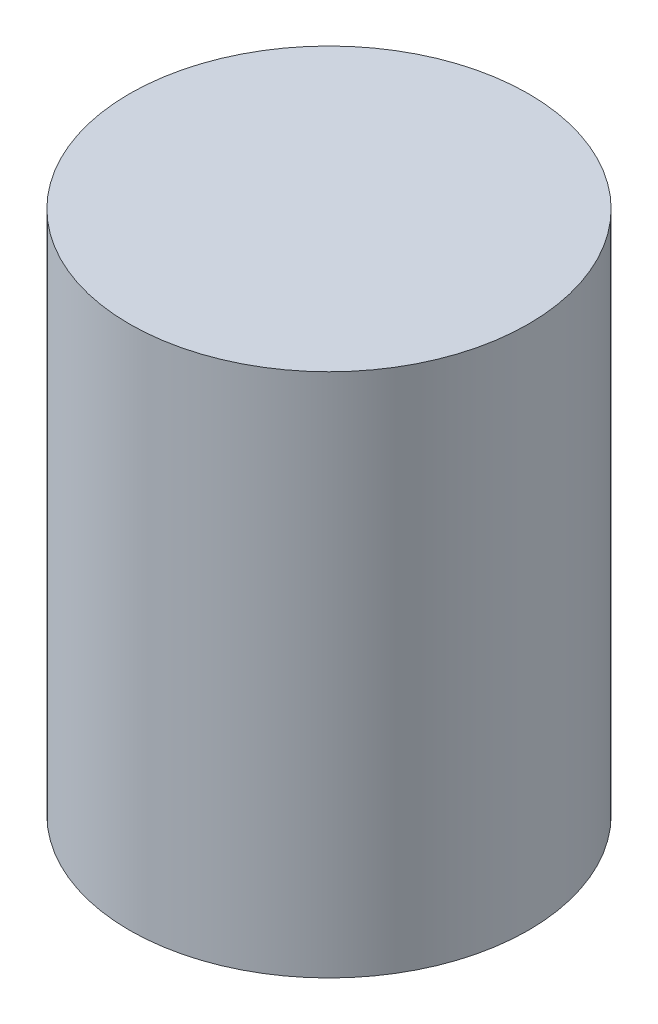
ISO-10303-21;
HEADER;
FILE_DESCRIPTION(('STEP AP214'),'2;1');
FILE_NAME('part.step','',(''),(''),'','','');
FILE_SCHEMA(('AUTOMOTIVE_DESIGN { 1 0 10303 214 1 1 1 1 }'));
ENDSEC;
DATA;
#1=APPLICATION_CONTEXT('core data for automotive mechanical design processes');
#2=APPLICATION_PROTOCOL_DEFINITION('international standard','automotive_design',2000,#1);
#3=PRODUCT_CONTEXT('',#1,'mechanical');
#4=PRODUCT('Part','Part','',(#3));
#5=PRODUCT_RELATED_PRODUCT_CATEGORY('part','',(#4));
#6=PRODUCT_DEFINITION_FORMATION('','',#4);
#7=PRODUCT_DEFINITION_CONTEXT('part definition',#1,'design');
#8=PRODUCT_DEFINITION('design','',#6,#7);
#9=PRODUCT_DEFINITION_SHAPE('','',#8);
#10=(LENGTH_UNIT() NAMED_UNIT(*) SI_UNIT(.MILLI.,.METRE.));
#11=(NAMED_UNIT(*) PLANE_ANGLE_UNIT() SI_UNIT($,.RADIAN.));
#12=(NAMED_UNIT(*) SI_UNIT($,.STERADIAN.) SOLID_ANGLE_UNIT());
#13=UNCERTAINTY_MEASURE_WITH_UNIT(LENGTH_MEASURE(1.E-05),#10,'distance_accuracy_value','');
#14=(GEOMETRIC_REPRESENTATION_CONTEXT(3) GLOBAL_UNCERTAINTY_ASSIGNED_CONTEXT((#13)) GLOBAL_UNIT_ASSIGNED_CONTEXT((#10,
#11,#12)) REPRESENTATION_CONTEXT('',''));
#15=CARTESIAN_POINT('',(0.,0.,0.));
#16=DIRECTION('',(0.,0.,1.));
#17=DIRECTION('',(1.,0.,0.));
#18=AXIS2_PLACEMENT_3D('',#15,#16,#17);
#19=CARTESIAN_POINT('',(0.,31.5,0.));
#20=DIRECTION('',(0.,-1.,0.));
#21=DIRECTION('',(0.,0.,-1.));
#22=AXIS2_PLACEMENT_3D('',#19,#20,#21);
#23=CYLINDRICAL_SURFACE('',#22,28.5);
#24=CARTESIAN_POINT('',(0.,31.5,0.));
#25=DIRECTION('',(0.,1.,0.));
#26=DIRECTION('',(0.,0.,1.));
#27=AXIS2_PLACEMENT_3D('',#24,#25,#26);
#28=CIRCLE('',#27,28.5);
#29=CARTESIAN_POINT('',(0.,31.5,28.5));
#30=VERTEX_POINT('',#29);
#31=EDGE_CURVE('E9',#30,#30,#28,.T.);
#32=ORIENTED_EDGE('',*,*,#31,.F.);
#33=EDGE_LOOP('',(#32));
#34=FACE_BOUND('',#33,.T.);
#35=CARTESIAN_POINT('',(0.,-43.5,0.));
#36=DIRECTION('',(0.,1.,0.));
#37=DIRECTION('',(0.,0.,1.));
#38=AXIS2_PLACEMENT_3D('',#35,#36,#37);
#39=CIRCLE('',#38,28.5);
#40=CARTESIAN_POINT('',(0.,-43.5,28.5));
#41=VERTEX_POINT('',#40);
#42=EDGE_CURVE('E17',#41,#41,#39,.T.);
#43=ORIENTED_EDGE('',*,*,#42,.T.);
#44=EDGE_LOOP('',(#43));
#45=FACE_BOUND('',#44,.T.);
#46=ADVANCED_FACE('F14',(#34,#45),#23,.T.);
#47=CARTESIAN_POINT('',(0.,31.5,0.));
#48=DIRECTION('',(0.,1.,0.));
#49=DIRECTION('',(0.,0.,1.));
#50=AXIS2_PLACEMENT_3D('',#47,#48,#49);
#51=PLANE('',#50);
#52=ORIENTED_EDGE('',*,*,#31,.T.);
#53=EDGE_LOOP('',(#52));
#54=FACE_BOUND('',#53,.T.);
#55=ADVANCED_FACE('F29',(#54),#51,.T.);
#56=CARTESIAN_POINT('',(0.,-43.5,0.));
#57=DIRECTION('',(0.,1.,0.));
#58=DIRECTION('',(0.,0.,1.));
#59=AXIS2_PLACEMENT_3D('',#56,#57,#58);
#60=PLANE('',#59);
#61=ORIENTED_EDGE('',*,*,#42,.F.);
#62=EDGE_LOOP('',(#61));
#63=FACE_BOUND('',#62,.T.);
#64=ADVANCED_FACE('F27',(#63),#60,.F.);
#65=CLOSED_SHELL('',(#46,#55,#64));
#66=MANIFOLD_SOLID_BREP('B1',#65);
#67=ADVANCED_BREP_SHAPE_REPRESENTATION('',(#18,#66),#14);
#68=SHAPE_DEFINITION_REPRESENTATION(#9,#67);
ENDSEC;
END-ISO-10303-21;
